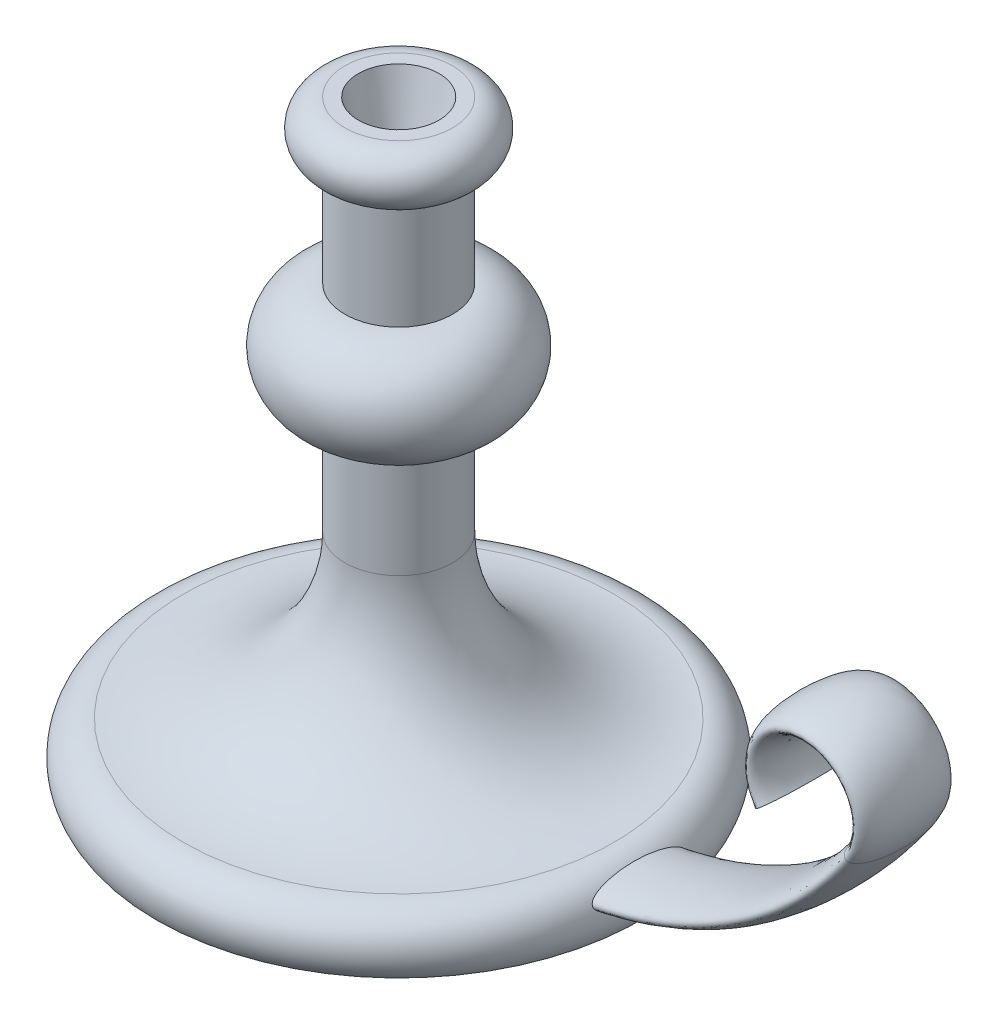
ISO-10303-21;
HEADER;
FILE_DESCRIPTION(('STEP AP214'),'2;1');
FILE_NAME('part.step','',(''),(''),'','','');
FILE_SCHEMA(('AUTOMOTIVE_DESIGN { 1 0 10303 214 1 1 1 1 }'));
ENDSEC;
DATA;
#1=APPLICATION_CONTEXT('core data for automotive mechanical design processes');
#2=APPLICATION_PROTOCOL_DEFINITION('international standard','automotive_design',2000,#1);
#3=PRODUCT_CONTEXT('',#1,'mechanical');
#4=PRODUCT('Part','Part','',(#3));
#5=PRODUCT_RELATED_PRODUCT_CATEGORY('part','',(#4));
#6=PRODUCT_DEFINITION_FORMATION('','',#4);
#7=PRODUCT_DEFINITION_CONTEXT('part definition',#1,'design');
#8=PRODUCT_DEFINITION('design','',#6,#7);
#9=PRODUCT_DEFINITION_SHAPE('','',#8);
#10=(LENGTH_UNIT() NAMED_UNIT(*) SI_UNIT(.MILLI.,.METRE.));
#11=(NAMED_UNIT(*) PLANE_ANGLE_UNIT() SI_UNIT($,.RADIAN.));
#12=(NAMED_UNIT(*) SI_UNIT($,.STERADIAN.) SOLID_ANGLE_UNIT());
#13=UNCERTAINTY_MEASURE_WITH_UNIT(LENGTH_MEASURE(1.E-05),#10,'distance_accuracy_value','');
#14=(GEOMETRIC_REPRESENTATION_CONTEXT(3) GLOBAL_UNCERTAINTY_ASSIGNED_CONTEXT((#13)) GLOBAL_UNIT_ASSIGNED_CONTEXT((#10,
#11,#12)) REPRESENTATION_CONTEXT('',''));
#15=CARTESIAN_POINT('',(0.,0.,0.));
#16=DIRECTION('',(0.,0.,1.));
#17=DIRECTION('',(1.,0.,0.));
#18=AXIS2_PLACEMENT_3D('',#15,#16,#17);
#19=CARTESIAN_POINT('',(0.,0.,0.));
#20=DIRECTION('',(0.,-1.,0.));
#21=DIRECTION('',(0.,0.,-1.));
#22=AXIS2_PLACEMENT_3D('',#19,#20,#21);
#23=PLANE('',#22);
#24=CARTESIAN_POINT('',(0.,0.,0.));
#25=DIRECTION('',(0.,-1.,0.));
#26=DIRECTION('',(0.,0.,-1.));
#27=AXIS2_PLACEMENT_3D('',#24,#25,#26);
#28=CIRCLE('',#27,90.);
#29=CARTESIAN_POINT('',(0.,0.,-90.));
#30=VERTEX_POINT('',#29);
#31=EDGE_CURVE('E56',#30,#30,#28,.T.);
#32=ORIENTED_EDGE('',*,*,#31,.T.);
#33=EDGE_LOOP('',(#32));
#34=FACE_BOUND('',#33,.T.);
#35=ADVANCED_FACE('F39',(#34),#23,.T.);
#36=CARTESIAN_POINT('',(0.,220.,0.));
#37=DIRECTION('',(0.,1.,0.));
#38=DIRECTION('',(0.,0.,1.));
#39=AXIS2_PLACEMENT_3D('',#36,#37,#38);
#40=PLANE('',#39);
#41=CARTESIAN_POINT('',(0.,220.,0.));
#42=DIRECTION('',(0.,1.,0.));
#43=DIRECTION('',(0.,0.,1.));
#44=AXIS2_PLACEMENT_3D('',#41,#42,#43);
#45=CIRCLE('',#44,15.);
#46=CARTESIAN_POINT('',(0.,220.,15.));
#47=VERTEX_POINT('',#46);
#48=EDGE_CURVE('E153',#47,#47,#45,.T.);
#49=ORIENTED_EDGE('',*,*,#48,.F.);
#50=EDGE_LOOP('',(#49));
#51=FACE_BOUND('',#50,.T.);
#52=CARTESIAN_POINT('',(0.,220.,0.));
#53=DIRECTION('',(0.,-1.,0.));
#54=DIRECTION('',(0.,0.,-1.));
#55=AXIS2_PLACEMENT_3D('',#52,#53,#54);
#56=CIRCLE('',#55,20.);
#57=CARTESIAN_POINT('',(0.,220.,-20.));
#58=VERTEX_POINT('',#57);
#59=EDGE_CURVE('E49',#58,#58,#56,.T.);
#60=ORIENTED_EDGE('',*,*,#59,.F.);
#61=EDGE_LOOP('',(#60));
#62=FACE_BOUND('',#61,.T.);
#63=ADVANCED_FACE('F86',(#51,#62),#40,.T.);
#64=CARTESIAN_POINT('',(0.,210.,0.));
#65=DIRECTION('',(0.,-1.,0.));
#66=DIRECTION('',(0.,0.,-1.));
#67=AXIS2_PLACEMENT_3D('',#64,#65,#66);
#68=TOROIDAL_SURFACE('',#67,20.,10.);
#69=ORIENTED_EDGE('',*,*,#59,.T.);
#70=EDGE_LOOP('',(#69));
#71=FACE_BOUND('',#70,.T.);
#72=CARTESIAN_POINT('',(0.,200.,0.));
#73=DIRECTION('',(0.,-1.,0.));
#74=DIRECTION('',(0.,0.,-1.));
#75=AXIS2_PLACEMENT_3D('',#72,#73,#74);
#76=CIRCLE('',#75,20.);
#77=CARTESIAN_POINT('',(0.,200.,-20.));
#78=VERTEX_POINT('',#77);
#79=EDGE_CURVE('E78',#78,#78,#76,.T.);
#80=ORIENTED_EDGE('',*,*,#79,.F.);
#81=EDGE_LOOP('',(#80));
#82=FACE_BOUND('',#81,.T.);
#83=ADVANCED_FACE('F83',(#71,#82),#68,.T.);
#84=CARTESIAN_POINT('',(0.,0.,0.));
#85=DIRECTION('',(0.,-1.,0.));
#86=DIRECTION('',(0.,0.,-1.));
#87=AXIS2_PLACEMENT_3D('',#84,#85,#86);
#88=CYLINDRICAL_SURFACE('',#87,20.);
#89=ORIENTED_EDGE('',*,*,#79,.T.);
#90=EDGE_LOOP('',(#89));
#91=FACE_BOUND('',#90,.T.);
#92=CARTESIAN_POINT('',(0.,160.,0.));
#93=DIRECTION('',(0.,-1.,0.));
#94=DIRECTION('',(0.,0.,-1.));
#95=AXIS2_PLACEMENT_3D('',#92,#93,#94);
#96=CIRCLE('',#95,20.);
#97=CARTESIAN_POINT('',(0.,160.,-20.));
#98=VERTEX_POINT('',#97);
#99=EDGE_CURVE('E75',#98,#98,#96,.T.);
#100=ORIENTED_EDGE('',*,*,#99,.F.);
#101=EDGE_LOOP('',(#100));
#102=FACE_BOUND('',#101,.T.);
#103=ADVANCED_FACE('F94',(#91,#102),#88,.T.);
#104=CARTESIAN_POINT('',(0.,140.,0.));
#105=DIRECTION('',(0.,-1.,0.));
#106=DIRECTION('',(0.,0.,-1.));
#107=AXIS2_PLACEMENT_3D('',#104,#105,#106);
#108=TOROIDAL_SURFACE('',#107,20.,20.);
#109=ORIENTED_EDGE('',*,*,#99,.T.);
#110=EDGE_LOOP('',(#109));
#111=FACE_BOUND('',#110,.T.);
#112=CARTESIAN_POINT('',(0.,120.,0.));
#113=DIRECTION('',(0.,-1.,0.));
#114=DIRECTION('',(0.,0.,-1.));
#115=AXIS2_PLACEMENT_3D('',#112,#113,#114);
#116=CIRCLE('',#115,20.);
#117=CARTESIAN_POINT('',(0.,120.,-20.));
#118=VERTEX_POINT('',#117);
#119=EDGE_CURVE('E72',#118,#118,#116,.T.);
#120=ORIENTED_EDGE('',*,*,#119,.F.);
#121=EDGE_LOOP('',(#120));
#122=FACE_BOUND('',#121,.T.);
#123=ADVANCED_FACE('F102',(#111,#122),#108,.T.);
#124=CARTESIAN_POINT('',(0.,0.,0.));
#125=DIRECTION('',(0.,-1.,0.));
#126=DIRECTION('',(0.,0.,-1.));
#127=AXIS2_PLACEMENT_3D('',#124,#125,#126);
#128=CYLINDRICAL_SURFACE('',#127,20.);
#129=ORIENTED_EDGE('',*,*,#119,.T.);
#130=EDGE_LOOP('',(#129));
#131=FACE_BOUND('',#130,.T.);
#132=CARTESIAN_POINT('',(0.,80.,0.));
#133=DIRECTION('',(0.,-1.,0.));
#134=DIRECTION('',(0.,0.,-1.));
#135=AXIS2_PLACEMENT_3D('',#132,#133,#134);
#136=CIRCLE('',#135,20.);
#137=CARTESIAN_POINT('',(0.,80.,-20.));
#138=VERTEX_POINT('',#137);
#139=EDGE_CURVE('E69',#138,#138,#136,.T.);
#140=ORIENTED_EDGE('',*,*,#139,.F.);
#141=EDGE_LOOP('',(#140));
#142=FACE_BOUND('',#141,.T.);
#143=ADVANCED_FACE('F106',(#131,#142),#128,.T.);
#144=CARTESIAN_POINT('',(0.,80.,0.));
#145=DIRECTION('',(0.,-1.,0.));
#146=DIRECTION('',(0.,0.,-1.));
#147=AXIS2_PLACEMENT_3D('',#144,#145,#146);
#148=TOROIDAL_SURFACE('',#147,80.,60.);
#149=ORIENTED_EDGE('',*,*,#139,.T.);
#150=EDGE_LOOP('',(#149));
#151=FACE_BOUND('',#150,.T.);
#152=CARTESIAN_POINT('',(0.,20.,0.));
#153=DIRECTION('',(0.,-1.,0.));
#154=DIRECTION('',(0.,0.,-1.));
#155=AXIS2_PLACEMENT_3D('',#152,#153,#154);
#156=CIRCLE('',#155,80.);
#157=CARTESIAN_POINT('',(0.,20.,-80.));
#158=VERTEX_POINT('',#157);
#159=EDGE_CURVE('E60',#158,#158,#156,.T.);
#160=ORIENTED_EDGE('',*,*,#159,.F.);
#161=EDGE_LOOP('',(#160));
#162=FACE_BOUND('',#161,.T.);
#163=ADVANCED_FACE('F110',(#151,#162),#148,.F.);
#164=CARTESIAN_POINT('',(0.,7.50000000000003,0.));
#165=DIRECTION('',(0.,-1.,0.));
#166=DIRECTION('',(0.,0.,-1.));
#167=AXIS2_PLACEMENT_3D('',#164,#165,#166);
#168=TOROIDAL_SURFACE('',#167,80.,12.5);
#169=CARTESIAN_POINT('',(89.5597422043341,12.9414346567556,-17.5));
#170=CARTESIAN_POINT('',(89.5390618403561,12.9834100865229,-17.4999996776707));
#171=CARTESIAN_POINT('',(89.5184817634659,13.0254349004938,-17.4978446678338));
#172=CARTESIAN_POINT('',(89.4776811982744,13.1092324497794,-17.4892861575811));
#173=CARTESIAN_POINT('',(89.4574608430711,13.1510050881611,-17.4828811168849));
#174=CARTESIAN_POINT('',(89.397540281121,13.2754779151414,-17.4575154450276));
#175=CARTESIAN_POINT('',(89.3585808220613,13.357332519418,-17.4324042670614));
#176=CARTESIAN_POINT('',(89.2734407804368,13.5379179993389,-17.3597430943198));
#177=CARTESIAN_POINT('',(89.2281116968574,13.6353152430682,-17.3079906529225));
#178=CARTESIAN_POINT('',(89.142156713761,13.8217570109409,-17.1881654215547));
#179=CARTESIAN_POINT('',(89.1015409681601,13.9107834263932,-17.1200583326704));
#180=CARTESIAN_POINT('',(89.0298799325305,14.0690063055582,-16.9825317839868));
#181=CARTESIAN_POINT('',(88.9982856031081,14.1392491335227,-16.9145677994464));
#182=CARTESIAN_POINT('',(88.9378435588022,14.2742914925202,-16.7722502997375));
#183=CARTESIAN_POINT('',(88.9089980734782,14.3390866000317,-16.6978916893925));
#184=CARTESIAN_POINT('',(88.8536099995594,14.4639626152392,-16.5442177801531));
#185=CARTESIAN_POINT('',(88.8270733532937,14.5240313225779,-16.4648905452803));
#186=CARTESIAN_POINT('',(88.7760376587064,14.6398576639347,-16.3025863942461));
#187=CARTESIAN_POINT('',(88.7515379613229,14.6956166708123,-16.2196106536441));
#188=CARTESIAN_POINT('',(88.704732820549,14.8023169553036,-16.052427362784));
#189=CARTESIAN_POINT('',(88.6823939519366,14.8533308765833,-15.9682752160745));
#190=CARTESIAN_POINT('',(88.639155365759,14.9521540950118,-15.797741621076));
#191=CARTESIAN_POINT('',(88.6182558899722,14.9999628537458,-15.711359801597));
#192=CARTESIAN_POINT('',(88.5573681790009,15.1392585624723,-15.4492483073625));
#193=CARTESIAN_POINT('',(88.5192579811328,15.2264609786255,-15.2707999543232));
#194=CARTESIAN_POINT('',(88.4468979005837,15.3916731276291,-14.9088289385944));
#195=CARTESIAN_POINT('',(88.4126513155027,15.4696750103546,-14.725302105289));
#196=CARTESIAN_POINT('',(88.347139159504,15.6182965032923,-14.3538259785736));
#197=CARTESIAN_POINT('',(88.3158872528146,15.6888824046965,-14.1658608782527));
#198=CARTESIAN_POINT('',(88.2560127035517,15.8233792512431,-13.787400391854));
#199=CARTESIAN_POINT('',(88.2273872233003,15.8872974109117,-13.5969079973402));
#200=CARTESIAN_POINT('',(88.1723348827449,16.0094159388249,-13.213849673779));
#201=CARTESIAN_POINT('',(88.1459074726896,16.06761773743,-13.021284276893));
#202=CARTESIAN_POINT('',(88.0884248304702,16.1932687928886,-12.5849658119247));
#203=CARTESIAN_POINT('',(88.0579162002184,16.2592725226906,-12.3407253521734));
#204=CARTESIAN_POINT('',(87.9994625659014,16.3844358500306,-11.8501803460781));
#205=CARTESIAN_POINT('',(87.9715178234089,16.4435947494061,-11.6038755919222));
#206=CARTESIAN_POINT('',(87.9178897421858,16.5558889779776,-11.1095299870479));
#207=CARTESIAN_POINT('',(87.8922075114269,16.6090213595568,-10.86148834924));
#208=CARTESIAN_POINT('',(87.8429155378603,16.7098546386226,-10.3640943607017));
#209=CARTESIAN_POINT('',(87.8193058942812,16.7575552760879,-10.114741947821));
#210=CARTESIAN_POINT('',(87.7514718906048,16.8930622945828,-9.366313966449));
#211=CARTESIAN_POINT('',(87.7101114199141,16.97354616682,-8.86564202060314));
#212=CARTESIAN_POINT('',(87.6344118706354,17.1178657179368,-7.86153551840229));
#213=CARTESIAN_POINT('',(87.600071334108,17.1817048544489,-7.35810155802565));
#214=CARTESIAN_POINT('',(87.5383679228555,17.2943697092708,-6.35225136111875));
#215=CARTESIAN_POINT('',(87.5109639050819,17.3432843238913,-5.84984753787557));
#216=CARTESIAN_POINT('',(87.4628391630612,17.4279603163538,-4.8435422883101));
#217=CARTESIAN_POINT('',(87.4421195253373,17.4637195559667,-4.33964063194089));
#218=CARTESIAN_POINT('',(87.4074386787955,17.5229738360405,-3.33084363886012));
#219=CARTESIAN_POINT('',(87.3934780874882,17.5464677559495,-2.8259482155868));
#220=CARTESIAN_POINT('',(87.3724154174236,17.5817273168609,-1.81615213380801));
#221=CARTESIAN_POINT('',(87.365305974734,17.5935055508652,-1.31125206554518));
#222=CARTESIAN_POINT('',(87.3579750479625,17.6056484066489,-0.301318309132876));
#223=CARTESIAN_POINT('',(87.3577528582351,17.6060141977103,0.203715360026127));
#224=CARTESIAN_POINT('',(87.3641963426439,17.5953454261038,1.21356726554173));
#225=CARTESIAN_POINT('',(87.3708612610896,17.5843121142068,1.71838551945513));
#226=CARTESIAN_POINT('',(87.3886163883338,17.554616306541,2.60695068649858));
#227=CARTESIAN_POINT('',(87.3982690399213,17.5384060734754,2.99081046478845));
#228=CARTESIAN_POINT('',(87.421496688066,17.4990063104014,3.75807002785718));
#229=CARTESIAN_POINT('',(87.4350718235981,17.4758165331044,4.14146979585434));
#230=CARTESIAN_POINT('',(87.4661109016122,17.4221255760208,4.90767543763215));
#231=CARTESIAN_POINT('',(87.4835755913649,17.3916229911934,5.29048118303766));
#232=CARTESIAN_POINT('',(87.52247652696,17.3226675403927,6.05728766608044));
#233=CARTESIAN_POINT('',(87.5439339089184,17.2841722314846,6.44128353835449));
#234=CARTESIAN_POINT('',(87.5907685418078,17.1987228636429,7.20803081067565));
#235=CARTESIAN_POINT('',(87.6161451191906,17.1517702579396,7.5907824130424));
#236=CARTESIAN_POINT('',(87.6708875244929,17.0486132676472,8.35453102594125));
#237=CARTESIAN_POINT('',(87.7002509792864,16.9924143825779,8.73552894189146));
#238=CARTESIAN_POINT('',(87.7555693385742,16.8844873931684,9.40362807317357));
#239=CARTESIAN_POINT('',(87.7806318626291,16.8349635590468,9.69115955865574));
#240=CARTESIAN_POINT('',(87.8333287645208,16.7293167465828,10.2648242071224));
#241=CARTESIAN_POINT('',(87.8609635304673,16.6731927720484,10.5509571522124));
#242=CARTESIAN_POINT('',(87.919067813825,16.5534902310351,11.1217112831614));
#243=CARTESIAN_POINT('',(87.9495404231885,16.4899035134825,11.4063304543326));
#244=CARTESIAN_POINT('',(88.0137266324376,16.3541216812726,11.9738772339478));
#245=CARTESIAN_POINT('',(88.0474477220508,16.2819065762201,12.25679925459));
#246=CARTESIAN_POINT('',(88.1183718381954,16.1280994435203,12.817582109759));
#247=CARTESIAN_POINT('',(88.1555499028384,16.046573796357,13.0954641920684));
#248=CARTESIAN_POINT('',(88.2343580118386,15.8719007074313,13.6468218234689));
#249=CARTESIAN_POINT('',(88.275985729586,15.7787593350284,13.9202995902184));
#250=CARTESIAN_POINT('',(88.342656822394,15.6283840406489,14.3254052817093));
#251=CARTESIAN_POINT('',(88.3655500017785,15.5765627213431,14.4594023169282));
#252=CARTESIAN_POINT('',(88.4129882653633,15.4688611687534,14.7254525655377));
#253=CARTESIAN_POINT('',(88.4375331689951,15.4129813790935,14.8575059894889));
#254=CARTESIAN_POINT('',(88.4884967907573,15.296726972035,15.1188747284345));
#255=CARTESIAN_POINT('',(88.5149109123159,15.2363633637365,15.2481958098581));
#256=CARTESIAN_POINT('',(88.5700241751772,15.1103179001211,15.5037035642083));
#257=CARTESIAN_POINT('',(88.5987227483179,15.0446373670988,15.6298910063175));
#258=CARTESIAN_POINT('',(88.6570151826479,14.9113179601608,15.8704199707061));
#259=CARTESIAN_POINT('',(88.6864417367861,14.8440563407288,15.9850095995262));
#260=CARTESIAN_POINT('',(88.7482816567769,14.7030103830826,16.2094581395954));
#261=CARTESIAN_POINT('',(88.7806974756142,14.629220689998,16.319313055117));
#262=CARTESIAN_POINT('',(88.8489097184973,14.474563961653,16.5315146626625));
#263=CARTESIAN_POINT('',(88.8846785573509,14.393755019161,16.6339121024917));
#264=CARTESIAN_POINT('',(88.9606113704153,14.2232561160766,16.8291907541923));
#265=CARTESIAN_POINT('',(89.0007675950253,14.1335818404864,16.9220882016583));
#266=CARTESIAN_POINT('',(89.0601235459873,14.0021924630804,17.0411637727685));
#267=CARTESIAN_POINT('',(89.0770574086406,13.9648250339926,17.073294917827));
#268=CARTESIAN_POINT('',(89.111770404309,13.8885105828122,17.1351129203989));
#269=CARTESIAN_POINT('',(89.1295494801999,13.8495636674961,17.1647999427302));
#270=CARTESIAN_POINT('',(89.1842722230348,13.7301865324197,17.2496672583031));
#271=CARTESIAN_POINT('',(89.2225929343977,13.6472387371286,17.3006362954167));
#272=CARTESIAN_POINT('',(89.2830198855205,13.5177923286576,17.3659392171785));
#273=CARTESIAN_POINT('',(89.3038035106326,13.473489983239,17.385944655127));
#274=CARTESIAN_POINT('',(89.3462357272131,13.3835498526411,17.421521231844));
#275=CARTESIAN_POINT('',(89.3678838017236,13.3379128698457,17.4370949768748));
#276=CARTESIAN_POINT('',(89.411904802424,13.2456714845447,17.4633118273199));
#277=CARTESIAN_POINT('',(89.4342765183817,13.1990687398023,17.4739627514633));
#278=CARTESIAN_POINT('',(89.4796070415907,13.1052444737536,17.4900003628641));
#279=CARTESIAN_POINT('',(89.5025657624809,13.0580230439622,17.495387819971));
#280=CARTESIAN_POINT('',(89.5464271716018,12.9684112208444,17.5004320668286));
#281=CARTESIAN_POINT('',(89.5672934245652,12.9260327119426,17.5006298436875));
#282=CARTESIAN_POINT('',(89.6091580078857,12.8415284156483,17.496667300483));
#283=CARTESIAN_POINT('',(89.6301563797469,12.7994027167221,17.4925055351934));
#284=CARTESIAN_POINT('',(89.6721156351431,12.7157496198108,17.479965082583));
#285=CARTESIAN_POINT('',(89.6930765014329,12.6742224548788,17.4715847960013));
#286=CARTESIAN_POINT('',(89.7348115258834,12.5920532516238,17.450862522026));
#287=CARTESIAN_POINT('',(89.7555855765781,12.5514117057388,17.4385183877269));
#288=CARTESIAN_POINT('',(89.8013847331777,12.4623676182577,17.4070626989759));
#289=CARTESIAN_POINT('',(89.8263321178975,12.4142402057078,17.3870577635768));
#290=CARTESIAN_POINT('',(89.8756026524763,12.3198942829529,17.3423007335127));
#291=CARTESIAN_POINT('',(89.8999253272692,12.2736772101063,17.317545140678));
#292=CARTESIAN_POINT('',(89.9718636752115,12.1379719567038,17.2371059859824));
#293=CARTESIAN_POINT('',(90.0184026508769,12.0515209207989,17.1752845379973));
#294=CARTESIAN_POINT('',(90.1015176697338,11.8991704299986,17.0502729237444));
#295=CARTESIAN_POINT('',(90.1385373685485,11.8321383297489,16.9886971231213));
#296=CARTESIAN_POINT('',(90.2104869329279,11.7032426034951,16.8591573255862));
#297=CARTESIAN_POINT('',(90.24541514088,11.6413830620089,16.7911883686366));
#298=CARTESIAN_POINT('',(90.3133841124366,11.5222099067342,16.6502911436157));
#299=CARTESIAN_POINT('',(90.3464212107125,11.4649050425,16.577353807455));
#300=CARTESIAN_POINT('',(90.4107258034175,11.3544143267812,16.4277349965839));
#301=CARTESIAN_POINT('',(90.4419937497579,11.3012274221162,16.3510544874357));
#302=CARTESIAN_POINT('',(90.5066142435688,11.1922810586096,16.1853189525368));
#303=CARTESIAN_POINT('',(90.5397652495639,11.1369814833085,16.095884783533));
#304=CARTESIAN_POINT('',(90.6043042941242,11.0303194621557,15.9140859303204));
#305=CARTESIAN_POINT('',(90.6356921559876,10.9789574107339,15.8217209538334));
#306=CARTESIAN_POINT('',(90.6968383877971,10.879769884165,15.6347974994412));
#307=CARTESIAN_POINT('',(90.7265992701637,10.8319389137697,15.5402427441418));
#308=CARTESIAN_POINT('',(90.7846969346252,10.739329513768,15.3492353522603));
#309=CARTESIAN_POINT('',(90.8130337948204,10.6945509167066,15.2527828201662));
#310=CARTESIAN_POINT('',(90.877121220524,10.5940589597548,15.0277319837681));
#311=CARTESIAN_POINT('',(90.9124022819658,10.5393328792864,14.8985593440139));
#312=CARTESIAN_POINT('',(90.9809741103802,10.4339610325183,14.6380328432606));
#313=CARTESIAN_POINT('',(91.0142645951403,10.3833158444316,14.5066786763344));
#314=CARTESIAN_POINT('',(91.1115171918214,10.2366440116076,14.1096810918777));
#315=CARTESIAN_POINT('',(91.1727828792967,10.1460018602113,13.8413800425915));
#316=CARTESIAN_POINT('',(91.2892862812461,9.97615455726902,13.2997906638454));
#317=CARTESIAN_POINT('',(91.3445203789089,9.89695625887027,13.0264994554531));
#318=CARTESIAN_POINT('',(91.4499805719981,9.74769654866255,12.4748594155943));
#319=CARTESIAN_POINT('',(91.5001780442573,9.67768673078007,12.1964912536692));
#320=CARTESIAN_POINT('',(91.5957501918069,9.54592534416376,11.6372393425738));
#321=CARTESIAN_POINT('',(91.6411285723794,9.48416742117619,11.3563577087899));
#322=CARTESIAN_POINT('',(91.7275132616965,9.36779787162537,10.7925089006669));
#323=CARTESIAN_POINT('',(91.7685202729421,9.31318509647913,10.5095420692675));
#324=CARTESIAN_POINT('',(91.8503345045438,9.20520508711795,9.91387150213518));
#325=CARTESIAN_POINT('',(91.8907217744489,9.15249390095802,9.60099168323496));
#326=CARTESIAN_POINT('',(91.966921819911,9.05389158705524,8.97359688181827));
#327=CARTESIAN_POINT('',(92.0027343661631,9.0080008011613,8.659081818158));
#328=CARTESIAN_POINT('',(92.0700329889401,8.92240020575299,8.0286556880863));
#329=CARTESIAN_POINT('',(92.101517751625,8.88269227276187,7.71274422766344));
#330=CARTESIAN_POINT('',(92.1603325838503,8.80898713679298,7.07986626810457));
#331=CARTESIAN_POINT('',(92.187662500542,8.77499014390494,6.76289973059244));
#332=CARTESIAN_POINT('',(92.2635030013651,8.68114273902093,5.81249868362075));
#333=CARTESIAN_POINT('',(92.3060517448554,8.62919999492186,5.17778747193695));
#334=CARTESIAN_POINT('',(92.3760091017525,8.54431318450685,3.90627938186668));
#335=CARTESIAN_POINT('',(92.4034169750229,8.51137004695184,3.26948240305127));
#336=CARTESIAN_POINT('',(92.4435085691828,8.46331702284117,1.99545741778277));
#337=CARTESIAN_POINT('',(92.4562084043365,8.44818761908846,1.35823064985248));
#338=CARTESIAN_POINT('',(92.4671302630246,8.43517103988553,0.0834423270797591));
#339=CARTESIAN_POINT('',(92.4653514271759,8.43728488791035,-0.554119245389139));
#340=CARTESIAN_POINT('',(92.4472853754492,8.45883344750926,-1.82886328297101));
#341=CARTESIAN_POINT('',(92.4309954438923,8.47827140120333,-2.46604565478216));
#342=CARTESIAN_POINT('',(92.3836590626409,8.53514174464801,-3.73902583867131));
#343=CARTESIAN_POINT('',(92.3526140808133,8.5725723444523,-4.37482378215634));
#344=CARTESIAN_POINT('',(92.2921790866403,8.64621329195008,-5.36625544461107));
#345=CARTESIAN_POINT('',(92.2680118235608,8.67578736963492,-5.72271555901989));
#346=CARTESIAN_POINT('',(92.2147013952354,8.74146404735403,-6.43465819603411));
#347=CARTESIAN_POINT('',(92.1855583836332,8.7775664458055,-6.79014074848086));
#348=CARTESIAN_POINT('',(92.1221127048892,8.85679311513363,-7.49983836059578));
#349=CARTESIAN_POINT('',(92.0878103957548,8.89991689880835,-7.85405350646556));
#350=CARTESIAN_POINT('',(92.0137981226249,8.99384143269661,-8.56089767224));
#351=CARTESIAN_POINT('',(91.9740883343956,9.04464193338992,-8.91352674331418));
#352=CARTESIAN_POINT('',(91.9015818240062,9.13842562293729,-9.51226790233185));
#353=CARTESIAN_POINT('',(91.870237065407,9.17924629619448,-9.7588957593427));
#354=CARTESIAN_POINT('',(91.8045624920057,9.26550036635925,-10.2509419620309));
#355=CARTESIAN_POINT('',(91.7702327567069,9.31093364041782,-10.4963603397382));
#356=CARTESIAN_POINT('',(91.6984266463271,9.40685898724894,-10.9855805665742));
#357=CARTESIAN_POINT('',(91.6609523533815,9.45734771681978,-11.2293833718173));
#358=CARTESIAN_POINT('',(91.5826038967891,9.56401317099039,-11.7151775621053));
#359=CARTESIAN_POINT('',(91.5417298772535,9.62018965451328,-11.957169023458));
#360=CARTESIAN_POINT('',(91.4386423376745,9.76351210996397,-12.5384162018489));
#361=CARTESIAN_POINT('',(91.3745858903287,9.85386844470759,-12.8765786557776));
#362=CARTESIAN_POINT('',(91.2720163238266,10.0014015523808,-13.3793136041316));
#363=CARTESIAN_POINT('',(91.2367090969991,10.0526332971695,-13.5462966135011));
#364=CARTESIAN_POINT('',(91.1637294936456,10.159626184162,-13.8782853379559));
#365=CARTESIAN_POINT('',(91.126057223172,10.215387123302,-14.0432911413078));
#366=CARTESIAN_POINT('',(91.0448513753996,10.336938272787,-14.3844416693132));
#367=CARTESIAN_POINT('',(91.0010908407915,10.40317678906,-14.5603739146118));
#368=CARTESIAN_POINT('',(90.9100440331645,10.54285093242,-14.9085311659834));
#369=CARTESIAN_POINT('',(90.8627565865345,10.6162889577865,-15.0807549132317));
#370=CARTESIAN_POINT('',(90.7642492199853,10.7715651970483,-15.4195496037306));
#371=CARTESIAN_POINT('',(90.7130423069866,10.853375906557,-15.5861368065588));
#372=CARTESIAN_POINT('',(90.6058220172112,11.0275348916431,-15.9120386126952));
#373=CARTESIAN_POINT('',(90.549812820345,11.1198740259082,-16.0713593593326));
#374=CARTESIAN_POINT('',(90.4444082893049,11.2969255920343,-16.3465910082043));
#375=CARTESIAN_POINT('',(90.3961277047703,11.3791055101427,-16.4645448336192));
#376=CARTESIAN_POINT('',(90.2950977924847,11.5538633486869,-16.6911566146553));
#377=CARTESIAN_POINT('',(90.242339056253,11.6464633011955,-16.7997939840169));
#378=CARTESIAN_POINT('',(90.1590440243455,11.7953014200275,-16.9524870890688));
#379=CARTESIAN_POINT('',(90.1303607600846,11.8469859215399,-17.0019977189783));
#380=CARTESIAN_POINT('',(90.0716181087374,11.9538274561512,-17.0963102611101));
#381=CARTESIAN_POINT('',(90.0415584049393,12.0089852895526,-17.1411110817341));
#382=CARTESIAN_POINT('',(89.9801756575595,12.1227246632092,-17.2246441347399));
#383=CARTESIAN_POINT('',(89.948857753765,12.1812926416251,-17.2633984155374));
#384=CARTESIAN_POINT('',(89.8849549671328,12.3020144005064,-17.3335784406432));
#385=CARTESIAN_POINT('',(89.8523712452272,12.3641649194657,-17.3650107233705));
#386=CARTESIAN_POINT('',(89.7981176909033,12.4687258013537,-17.4092508881815));
#387=CARTESIAN_POINT('',(89.7767436177655,12.5101841078547,-17.4246893204628));
#388=CARTESIAN_POINT('',(89.7336969050674,12.5942336377179,-17.4515182330193));
#389=CARTESIAN_POINT('',(89.7120243813912,12.6368244270181,-17.4629102408533));
#390=CARTESIAN_POINT('',(89.6685521390583,12.7228207531293,-17.4812886417918));
#391=CARTESIAN_POINT('',(89.6467526103346,12.7662252198271,-17.488280453409));
#392=CARTESIAN_POINT('',(89.6031794397246,12.8535466229689,-17.4976362320133));
#393=CARTESIAN_POINT('',(89.5814057970822,12.8974635440192,-17.5000003376542));
#394=CARTESIAN_POINT('',(89.5597422043341,12.9414346567556,-17.5));
#395=B_SPLINE_CURVE_WITH_KNOTS('',3,(#169,#170,#171,#172,#173,#174,#175,#176,#177,#178,#179,
#180,#181,#182,#183,#184,#185,#186,#187,#188,#189,#190,#191,#192,#193,#194,#195,#196,#197,#198,
#199,#200,#201,#202,#203,#204,#205,#206,#207,#208,#209,#210,#211,#212,#213,#214,#215,#216,#217,
#218,#219,#220,#221,#222,#223,#224,#225,#226,#227,#228,#229,#230,#231,#232,#233,#234,#235,#236,
#237,#238,#239,#240,#241,#242,#243,#244,#245,#246,#247,#248,#249,#250,#251,#252,#253,#254,#255,
#256,#257,#258,#259,#260,#261,#262,#263,#264,#265,#266,#267,#268,#269,#270,#271,#272,#273,#274,
#275,#276,#277,#278,#279,#280,#281,#282,#283,#284,#285,#286,#287,#288,#289,#290,#291,#292,#293,
#294,#295,#296,#297,#298,#299,#300,#301,#302,#303,#304,#305,#306,#307,#308,#309,#310,#311,#312,
#313,#314,#315,#316,#317,#318,#319,#320,#321,#322,#323,#324,#325,#326,#327,#328,#329,#330,#331,
#332,#333,#334,#335,#336,#337,#338,#339,#340,#341,#342,#343,#344,#345,#346,#347,#348,#349,#350,
#351,#352,#353,#354,#355,#356,#357,#358,#359,#360,#361,#362,#363,#364,#365,#366,#367,#368,#369,
#370,#371,#372,#373,#374,#375,#376,#377,#378,#379,#380,#381,#382,#383,#384,#385,#386,#387,#388,
#389,#390,#391,#392,#393,#394),.UNSPECIFIED.,.T.,.F.,(4,2,2,2,2,2,2,2,2,2,2,2,2,2,2,2,2,2,2,2,2,
2,2,2,2,2,2,2,2,2,2,2,2,2,2,2,2,2,2,2,2,2,2,2,2,2,2,2,2,2,2,2,2,2,2,2,2,2,2,2,2,2,2,2,2,2,2,2,2,
2,2,2,2,2,2,2,2,2,2,2,2,2,2,2,2,2,2,2,2,2,2,2,2,2,2,2,2,2,2,2,2,2,2,2,2,2,2,2,2,2,2,2,4),(0.,
0.140326879649317,0.280704643844311,0.561461806499941,0.917225717585792,1.27374235386082,
1.58146302398144,1.88943119593638,2.19816989275471,2.50680983170021,2.80944292372745,
3.11212672643251,3.71838915770188,4.32516518168242,4.93458970782538,5.54334784093532,
6.15195325906643,6.9163191102904,7.68076285707082,8.4455789014472,9.21043154271125,
10.7363530227227,12.261957268085,13.7782885580523,15.2948661984783,16.8115823682402,
18.3266664767784,19.8415953542035,21.3563580231468,22.5092504482308,23.6621837256809,
24.8153386988898,25.9747813799631,27.1340250219355,28.2925816429425,29.1710242088839,
30.0495995331115,30.9291435591543,31.8107663507035,32.6864555684208,33.5616891298977,
33.9980703124478,34.4344038665404,34.8696994156048,35.3048870393031,35.7129485465614,
36.1213479397354,36.5266413619585,36.931230132163,37.0874810726011,37.2437214677038,
37.556282943945,37.7147148343191,37.8730533580127,38.0311395270883,38.1892025705742,
38.3307149014328,38.4722741597123,38.6138871242241,38.7555769191151,38.9286541005773,
39.1018592207181,39.448590135234,39.7429975955386,40.0376353818191,40.3328261359408,
40.6279411430423,40.9585479808936,41.2891878931731,41.6193018978018,41.9493977775692,
42.3832551508602,42.8171738887972,43.6859467918771,44.5552378220706,45.4292182663368,
46.3025217875286,47.1756847521819,48.135108186034,49.0945796914531,50.0543418354871,
51.0141392787943,52.9283366636022,54.8426276125096,56.7548192562825,58.6671243992178,
60.5797874956879,62.4922603557713,63.5676819321863,64.6430703071887,65.7183840946038,
66.7936629380634,67.5494303160612,68.3051775707199,69.0604283053784,69.8156470419359,
70.8826765887357,71.4172057561804,71.9517109715333,72.5305894861731,73.1096614946437,
73.6868888443996,74.2636187787015,74.7180950553378,75.1735510009091,75.4046853668804,
75.6358731855898,75.8661972266867,76.0963147970919,76.2435550398536,76.3907396389803,
76.5377426347989,76.6847412260986),.UNSPECIFIED.);
#396=CARTESIAN_POINT('',(89.5597422043341,12.9414346567556,-17.5));
#397=VERTEX_POINT('',#396);
#398=EDGE_CURVE('E11',#397,#397,#395,.T.);
#399=ORIENTED_EDGE('',*,*,#398,.F.);
#400=EDGE_LOOP('',(#399));
#401=FACE_BOUND('',#400,.T.);
#402=ORIENTED_EDGE('',*,*,#159,.T.);
#403=EDGE_LOOP('',(#402));
#404=FACE_BOUND('',#403,.T.);
#405=ORIENTED_EDGE('',*,*,#31,.F.);
#406=EDGE_LOOP('',(#405));
#407=FACE_BOUND('',#406,.T.);
#408=ADVANCED_FACE('F113',(#401,#404,#407),#168,.T.);
#409=CARTESIAN_POINT('',(150.634185358261,75.,0.));
#410=DIRECTION('',(0.566666666666666,-0.823947139620552,0.));
#411=DIRECTION('',(0.,0.,-1.));
#412=AXIS2_PLACEMENT_3D('',#409,#410,#411);
#413=PLANE('',#412);
#414=CARTESIAN_POINT('',(150.634185358261,75.,0.));
#415=DIRECTION('',(0.566666666666666,-0.823947139620552,0.));
#416=DIRECTION('',(0.,0.,-1.));
#417=AXIS2_PLACEMENT_3D('',#414,#415,#416);
#418=ELLIPSE('',#417,17.5,4.99999999999999);
#419=CARTESIAN_POINT('',(150.634185358261,75.,-17.5));
#420=VERTEX_POINT('',#419);
#421=EDGE_CURVE('E53',#420,#420,#418,.T.);
#422=ORIENTED_EDGE('',*,*,#421,.T.);
#423=EDGE_LOOP('',(#422));
#424=FACE_BOUND('',#423,.T.);
#425=ADVANCED_FACE('F54',(#424),#413,.T.);
#426=CARTESIAN_POINT('',(60.,10.,-17.5));
#427=CARTESIAN_POINT('',(110.410191303973,10.,-17.5));
#428=CARTESIAN_POINT('',(155.026295870831,33.4646670673665,-17.5));
#429=CARTESIAN_POINT('',(183.592070943083,75.,-17.5));
#430=CARTESIAN_POINT('',(60.,20.,-17.5));
#431=CARTESIAN_POINT('',(107.049511883708,20.,-17.5));
#432=CARTESIAN_POINT('',(148.691209479443,41.900355929542,-17.5));
#433=CARTESIAN_POINT('',(175.352599546877,80.6666666666666,-17.5));
#434=CARTESIAN_POINT('',(60.,20.,17.5));
#435=CARTESIAN_POINT('',(107.049511883708,20.,17.5));
#436=CARTESIAN_POINT('',(148.691209479443,41.900355929542,17.5));
#437=CARTESIAN_POINT('',(175.352599546877,80.6666666666666,17.5));
#438=CARTESIAN_POINT('',(60.,10.,17.5));
#439=CARTESIAN_POINT('',(110.410191303973,10.,17.5));
#440=CARTESIAN_POINT('',(155.026295870831,33.4646670673665,17.5));
#441=CARTESIAN_POINT('',(183.592070943083,75.,17.5));
#442=CARTESIAN_POINT('',(60.,0.,17.5));
#443=CARTESIAN_POINT('',(113.770870724238,0.,17.5));
#444=CARTESIAN_POINT('',(161.36138226222,25.0289782051909,17.5));
#445=CARTESIAN_POINT('',(191.831542339288,69.3333333333333,17.5));
#446=CARTESIAN_POINT('',(60.,0.,-17.5));
#447=CARTESIAN_POINT('',(113.770870724238,0.,-17.5));
#448=CARTESIAN_POINT('',(161.36138226222,25.0289782051909,-17.5));
#449=CARTESIAN_POINT('',(191.831542339288,69.3333333333333,-17.5));
#450=CARTESIAN_POINT('',(60.,10.,-17.5));
#451=CARTESIAN_POINT('',(110.410191303973,10.,-17.5));
#452=CARTESIAN_POINT('',(155.026295870831,33.4646670673665,-17.5));
#453=CARTESIAN_POINT('',(183.592070943083,75.,-17.5));
#454=(BOUNDED_SURFACE() B_SPLINE_SURFACE(3,3,((#426,#427,#428,#429),(#430,#431,#432,#433),(#434,
#435,#436,#437),(#438,#439,#440,#441),(#442,#443,#444,#445),(#446,#447,#448,#449),(#450,#451,
#452,#453)),.UNSPECIFIED.,.T.,.F.,.F.) B_SPLINE_SURFACE_WITH_KNOTS((4,3,4),(4,4),(0.,0.5,1.),
(0.,1.),.UNSPECIFIED.) GEOMETRIC_REPRESENTATION_ITEM() RATIONAL_B_SPLINE_SURFACE(((1.,
0.923374135437856,0.923374135437856,1.),(0.333333333333333,0.307791378479285,0.307791378479285,
0.333333333333333),(0.333333333333333,0.307791378479285,0.307791378479285,0.333333333333333),
(1.,0.923374135437856,0.923374135437856,1.),(0.333333333333333,0.307791378479285,
0.307791378479285,0.333333333333333),(0.333333333333333,0.307791378479285,0.307791378479285,
0.333333333333333),(1.,0.923374135437856,0.923374135437856,1.))) REPRESENTATION_ITEM('') SURFACE());
#455=CARTESIAN_POINT('',(183.592070943083,75.,0.));
#456=DIRECTION('',(0.566666666666667,0.823947139620552,0.));
#457=DIRECTION('',(0.,0.,-1.));
#458=AXIS2_PLACEMENT_3D('',#455,#456,#457);
#459=ELLIPSE('',#458,17.5,4.99999999999999);
#460=CARTESIAN_POINT('',(183.592070943083,75.,-17.5));
#461=VERTEX_POINT('',#460);
#462=EDGE_CURVE('E57',#461,#461,#459,.T.);
#463=ORIENTED_EDGE('',*,*,#398,.T.);
#464=EDGE_LOOP('',(#463));
#465=FACE_BOUND('',#464,.T.);
#466=ORIENTED_EDGE('',*,*,#462,.F.);
#467=EDGE_LOOP('',(#466));
#468=FACE_BOUND('',#467,.T.);
#469=ADVANCED_FACE('F122',(#465,#468),#454,.T.);
#470=CARTESIAN_POINT('',(183.592070943083,75.,-17.5));
#471=CARTESIAN_POINT('',(193.981461744242,90.10642735238,-17.5));
#472=CARTESIAN_POINT('',(185.447347211541,106.333333333333,-17.5));
#473=CARTESIAN_POINT('',(167.113128150672,106.333333333333,-17.5));
#474=CARTESIAN_POINT('',(148.778909089802,106.333333333333,-17.5));
#475=CARTESIAN_POINT('',(140.244794557101,90.1064273523801,-17.5));
#476=CARTESIAN_POINT('',(150.634185358261,75.,-17.5));
#477=CARTESIAN_POINT('',(175.352599546877,80.6666666666667,-17.5));
#478=CARTESIAN_POINT('',(180.547294947457,88.2198803428567,-17.5));
#479=CARTESIAN_POINT('',(176.280237681107,96.3333333333333,-17.5));
#480=CARTESIAN_POINT('',(167.113128150672,96.3333333333333,-17.5));
#481=CARTESIAN_POINT('',(157.946018620237,96.3333333333334,-17.5));
#482=CARTESIAN_POINT('',(153.678961353886,88.2198803428568,-17.5));
#483=CARTESIAN_POINT('',(158.873656754466,80.6666666666667,-17.5));
#484=CARTESIAN_POINT('',(175.352599546877,80.6666666666667,17.5));
#485=CARTESIAN_POINT('',(180.547294947457,88.2198803428567,17.5));
#486=CARTESIAN_POINT('',(176.280237681107,96.3333333333333,17.5));
#487=CARTESIAN_POINT('',(167.113128150672,96.3333333333333,17.5));
#488=CARTESIAN_POINT('',(157.946018620237,96.3333333333334,17.5));
#489=CARTESIAN_POINT('',(153.678961353886,88.2198803428568,17.5));
#490=CARTESIAN_POINT('',(158.873656754466,80.6666666666667,17.5));
#491=CARTESIAN_POINT('',(183.592070943083,75.,17.5));
#492=CARTESIAN_POINT('',(193.981461744242,90.10642735238,17.5));
#493=CARTESIAN_POINT('',(185.447347211541,106.333333333333,17.5));
#494=CARTESIAN_POINT('',(167.113128150672,106.333333333333,17.5));
#495=CARTESIAN_POINT('',(148.778909089802,106.333333333333,17.5));
#496=CARTESIAN_POINT('',(140.244794557101,90.1064273523801,17.5));
#497=CARTESIAN_POINT('',(150.634185358261,75.,17.5));
#498=CARTESIAN_POINT('',(191.831542339288,69.3333333333333,17.5));
#499=CARTESIAN_POINT('',(207.415628541027,91.9929743619034,17.5));
#500=CARTESIAN_POINT('',(194.614456741976,116.333333333333,17.5));
#501=CARTESIAN_POINT('',(167.113128150672,116.333333333333,17.5));
#502=CARTESIAN_POINT('',(139.611799559367,116.333333333333,17.5));
#503=CARTESIAN_POINT('',(126.810627760316,91.9929743619035,17.5));
#504=CARTESIAN_POINT('',(142.394713962055,69.3333333333334,17.5));
#505=CARTESIAN_POINT('',(191.831542339288,69.3333333333333,-17.5));
#506=CARTESIAN_POINT('',(207.415628541027,91.9929743619034,-17.5));
#507=CARTESIAN_POINT('',(194.614456741976,116.333333333333,-17.5));
#508=CARTESIAN_POINT('',(167.113128150672,116.333333333333,-17.5));
#509=CARTESIAN_POINT('',(139.611799559367,116.333333333333,-17.5));
#510=CARTESIAN_POINT('',(126.810627760316,91.9929743619035,-17.5));
#511=CARTESIAN_POINT('',(142.394713962055,69.3333333333334,-17.5));
#512=CARTESIAN_POINT('',(183.592070943083,75.,-17.5));
#513=CARTESIAN_POINT('',(193.981461744242,90.10642735238,-17.5));
#514=CARTESIAN_POINT('',(185.447347211541,106.333333333333,-17.5));
#515=CARTESIAN_POINT('',(167.113128150672,106.333333333333,-17.5));
#516=CARTESIAN_POINT('',(148.778909089802,106.333333333333,-17.5));
#517=CARTESIAN_POINT('',(140.244794557101,90.1064273523801,-17.5));
#518=CARTESIAN_POINT('',(150.634185358261,75.,-17.5));
#519=(BOUNDED_SURFACE() B_SPLINE_SURFACE(3,3,((#470,#471,#472,#473,#474,#475,#476),(#477,#478,
#479,#480,#481,#482,#483),(#484,#485,#486,#487,#488,#489,#490),(#491,#492,#493,#494,#495,#496,
#497),(#498,#499,#500,#501,#502,#503,#504),(#505,#506,#507,#508,#509,#510,#511),(#512,#513,#514,
#515,#516,#517,#518)),.UNSPECIFIED.,.T.,.F.,.F.) B_SPLINE_SURFACE_WITH_KNOTS((4,3,4),(4,3,4),
(0.,0.5,1.),(0.,0.5,1.),
.UNSPECIFIED.) GEOMETRIC_REPRESENTATION_ITEM() RATIONAL_B_SPLINE_SURFACE(((1.,0.643649778750421,
0.643649778750421,1.,0.643649778750421,0.643649778750421,1.),(0.333333333333333,
0.21454992625014,0.21454992625014,0.333333333333333,0.21454992625014,0.21454992625014,
0.333333333333333),(0.333333333333333,0.21454992625014,0.21454992625014,0.333333333333333,
0.21454992625014,0.21454992625014,0.333333333333333),(1.,0.643649778750421,0.643649778750421,1.,
0.643649778750421,0.643649778750421,1.),(0.333333333333333,0.21454992625014,0.21454992625014,
0.333333333333333,0.21454992625014,0.21454992625014,0.333333333333333),(0.333333333333333,
0.21454992625014,0.21454992625014,0.333333333333333,0.21454992625014,0.21454992625014,
0.333333333333333),(1.,0.643649778750421,0.643649778750421,1.,0.643649778750421,
0.643649778750421,1.))) REPRESENTATION_ITEM('') SURFACE());
#520=ORIENTED_EDGE('',*,*,#421,.F.);
#521=EDGE_LOOP('',(#520));
#522=FACE_BOUND('',#521,.T.);
#523=ORIENTED_EDGE('',*,*,#462,.T.);
#524=EDGE_LOOP('',(#523));
#525=FACE_BOUND('',#524,.T.);
#526=ADVANCED_FACE('F119',(#522,#525),#519,.T.);
#527=CARTESIAN_POINT('',(0.,220.,0.));
#528=DIRECTION('',(0.,1.,0.));
#529=DIRECTION('',(0.,0.,1.));
#530=AXIS2_PLACEMENT_3D('',#527,#528,#529);
#531=CONICAL_SURFACE('',#530,15.,0.26179938779915);
#532=CARTESIAN_POINT('',(0.,195.,0.));
#533=DIRECTION('',(0.,1.,0.));
#534=DIRECTION('',(0.,0.,1.));
#535=AXIS2_PLACEMENT_3D('',#532,#533,#534);
#536=CIRCLE('',#535,8.30127018922192);
#537=CARTESIAN_POINT('',(0.,195.,8.30127018922192));
#538=VERTEX_POINT('',#537);
#539=EDGE_CURVE('E63',#538,#538,#536,.T.);
#540=ORIENTED_EDGE('',*,*,#539,.F.);
#541=EDGE_LOOP('',(#540));
#542=FACE_BOUND('',#541,.T.);
#543=ORIENTED_EDGE('',*,*,#48,.T.);
#544=EDGE_LOOP('',(#543));
#545=FACE_BOUND('',#544,.T.);
#546=ADVANCED_FACE('F123',(#542,#545),#531,.F.);
#547=CARTESIAN_POINT('',(0.,195.,0.));
#548=DIRECTION('',(0.,1.,0.));
#549=DIRECTION('',(0.,0.,1.));
#550=AXIS2_PLACEMENT_3D('',#547,#548,#549);
#551=PLANE('',#550);
#552=ORIENTED_EDGE('',*,*,#539,.T.);
#553=EDGE_LOOP('',(#552));
#554=FACE_BOUND('',#553,.T.);
#555=ADVANCED_FACE('F145',(#554),#551,.T.);
#556=CLOSED_SHELL('',(#35,#63,#83,#103,#123,#143,#163,#408,#425,#469,#526,#546,#555));
#557=MANIFOLD_SOLID_BREP('B2',#556);
#558=ADVANCED_BREP_SHAPE_REPRESENTATION('',(#18,#557),#14);
#559=SHAPE_DEFINITION_REPRESENTATION(#9,#558);
ENDSEC;
END-ISO-10303-21;
